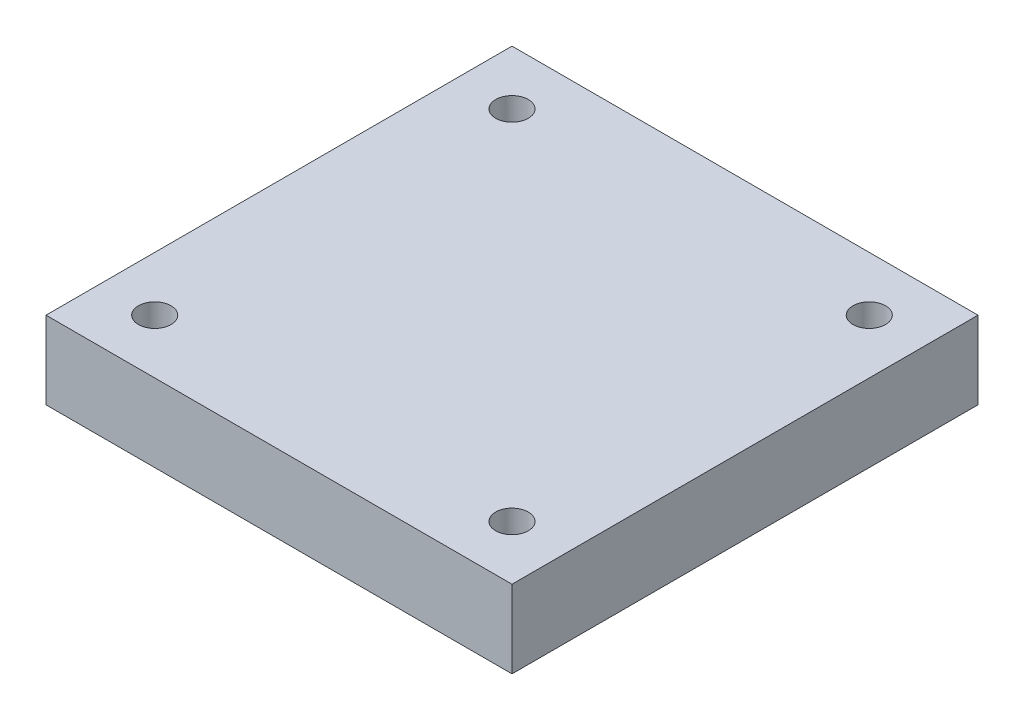
ISO-10303-21;
HEADER;
FILE_DESCRIPTION(('STEP AP214'),'2;1');
FILE_NAME('part.step','',(''),(''),'','','');
FILE_SCHEMA(('AUTOMOTIVE_DESIGN { 1 0 10303 214 1 1 1 1 }'));
ENDSEC;
DATA;
#1=APPLICATION_CONTEXT('core data for automotive mechanical design processes');
#2=APPLICATION_PROTOCOL_DEFINITION('international standard','automotive_design',2000,#1);
#3=PRODUCT_CONTEXT('',#1,'mechanical');
#4=PRODUCT('Part','Part','',(#3));
#5=PRODUCT_RELATED_PRODUCT_CATEGORY('part','',(#4));
#6=PRODUCT_DEFINITION_FORMATION('','',#4);
#7=PRODUCT_DEFINITION_CONTEXT('part definition',#1,'design');
#8=PRODUCT_DEFINITION('design','',#6,#7);
#9=PRODUCT_DEFINITION_SHAPE('','',#8);
#10=(LENGTH_UNIT() NAMED_UNIT(*) SI_UNIT(.MILLI.,.METRE.));
#11=(NAMED_UNIT(*) PLANE_ANGLE_UNIT() SI_UNIT($,.RADIAN.));
#12=(NAMED_UNIT(*) SI_UNIT($,.STERADIAN.) SOLID_ANGLE_UNIT());
#13=UNCERTAINTY_MEASURE_WITH_UNIT(LENGTH_MEASURE(1.E-05),#10,'distance_accuracy_value','');
#14=(GEOMETRIC_REPRESENTATION_CONTEXT(3) GLOBAL_UNCERTAINTY_ASSIGNED_CONTEXT((#13)) GLOBAL_UNIT_ASSIGNED_CONTEXT((#10,
#11,#12)) REPRESENTATION_CONTEXT('',''));
#15=CARTESIAN_POINT('',(0.,0.,0.));
#16=DIRECTION('',(0.,0.,1.));
#17=DIRECTION('',(1.,0.,0.));
#18=AXIS2_PLACEMENT_3D('',#15,#16,#17);
#19=CARTESIAN_POINT('',(30.,10.,30.));
#20=DIRECTION('',(-1.,0.,0.));
#21=DIRECTION('',(0.,0.,1.));
#22=AXIS2_PLACEMENT_3D('',#19,#20,#21);
#23=PLANE('',#22);
#24=DIRECTION('',(0.,0.,-1.));
#25=VECTOR('',#24,1.);
#26=CARTESIAN_POINT('',(30.,0.,30.));
#27=LINE('',#26,#25);
#28=CARTESIAN_POINT('',(30.,0.,30.));
#29=VERTEX_POINT('',#28);
#30=CARTESIAN_POINT('',(30.,0.,-30.));
#31=VERTEX_POINT('',#30);
#32=EDGE_CURVE('E98',#29,#31,#27,.T.);
#33=ORIENTED_EDGE('',*,*,#32,.T.);
#34=DIRECTION('',(0.,-1.,0.));
#35=VECTOR('',#34,1.);
#36=CARTESIAN_POINT('',(30.,10.,-30.));
#37=LINE('',#36,#35);
#38=CARTESIAN_POINT('',(30.,10.,-30.));
#39=VERTEX_POINT('',#38);
#40=EDGE_CURVE('E11',#39,#31,#37,.T.);
#41=ORIENTED_EDGE('',*,*,#40,.F.);
#42=DIRECTION('',(0.,0.,-1.));
#43=VECTOR('',#42,1.);
#44=CARTESIAN_POINT('',(30.,10.,30.));
#45=LINE('',#44,#43);
#46=CARTESIAN_POINT('',(30.,10.,30.));
#47=VERTEX_POINT('',#46);
#48=EDGE_CURVE('E86',#47,#39,#45,.T.);
#49=ORIENTED_EDGE('',*,*,#48,.F.);
#50=DIRECTION('',(0.,-1.,0.));
#51=VECTOR('',#50,1.);
#52=CARTESIAN_POINT('',(30.,10.,30.));
#53=LINE('',#52,#51);
#54=EDGE_CURVE('E94',#47,#29,#53,.T.);
#55=ORIENTED_EDGE('',*,*,#54,.T.);
#56=EDGE_LOOP('',(#33,#41,#49,#55));
#57=FACE_BOUND('',#56,.T.);
#58=ADVANCED_FACE('F35',(#57),#23,.F.);
#59=CARTESIAN_POINT('',(-30.,10.,-30.));
#60=DIRECTION('',(0.,0.,1.));
#61=DIRECTION('',(1.,0.,0.));
#62=AXIS2_PLACEMENT_3D('',#59,#60,#61);
#63=PLANE('',#62);
#64=DIRECTION('',(-1.,0.,0.));
#65=VECTOR('',#64,1.);
#66=CARTESIAN_POINT('',(-30.,0.,-30.));
#67=LINE('',#66,#65);
#68=CARTESIAN_POINT('',(-30.,0.,-30.));
#69=VERTEX_POINT('',#68);
#70=EDGE_CURVE('E90',#31,#69,#67,.T.);
#71=ORIENTED_EDGE('',*,*,#70,.T.);
#72=DIRECTION('',(0.,-1.,0.));
#73=VECTOR('',#72,1.);
#74=CARTESIAN_POINT('',(-30.,10.,-30.));
#75=LINE('',#74,#73);
#76=CARTESIAN_POINT('',(-30.,10.,-30.));
#77=VERTEX_POINT('',#76);
#78=EDGE_CURVE('E43',#77,#69,#75,.T.);
#79=ORIENTED_EDGE('',*,*,#78,.F.);
#80=DIRECTION('',(-1.,0.,0.));
#81=VECTOR('',#80,1.);
#82=CARTESIAN_POINT('',(-30.,10.,-30.));
#83=LINE('',#82,#81);
#84=EDGE_CURVE('E81',#39,#77,#83,.T.);
#85=ORIENTED_EDGE('',*,*,#84,.F.);
#86=ORIENTED_EDGE('',*,*,#40,.T.);
#87=EDGE_LOOP('',(#71,#79,#85,#86));
#88=FACE_BOUND('',#87,.T.);
#89=ADVANCED_FACE('F89',(#88),#63,.F.);
#90=CARTESIAN_POINT('',(-30.,10.,30.));
#91=DIRECTION('',(1.,0.,0.));
#92=DIRECTION('',(0.,0.,-1.));
#93=AXIS2_PLACEMENT_3D('',#90,#91,#92);
#94=PLANE('',#93);
#95=DIRECTION('',(0.,0.,1.));
#96=VECTOR('',#95,1.);
#97=CARTESIAN_POINT('',(-30.,0.,30.));
#98=LINE('',#97,#96);
#99=CARTESIAN_POINT('',(-30.,0.,30.));
#100=VERTEX_POINT('',#99);
#101=EDGE_CURVE('E68',#69,#100,#98,.T.);
#102=ORIENTED_EDGE('',*,*,#101,.T.);
#103=DIRECTION('',(0.,-1.,0.));
#104=VECTOR('',#103,1.);
#105=CARTESIAN_POINT('',(-30.,10.,30.));
#106=LINE('',#105,#104);
#107=CARTESIAN_POINT('',(-30.,10.,30.));
#108=VERTEX_POINT('',#107);
#109=EDGE_CURVE('E91',#108,#100,#106,.T.);
#110=ORIENTED_EDGE('',*,*,#109,.F.);
#111=DIRECTION('',(0.,0.,1.));
#112=VECTOR('',#111,1.);
#113=CARTESIAN_POINT('',(-30.,10.,30.));
#114=LINE('',#113,#112);
#115=EDGE_CURVE('E84',#77,#108,#114,.T.);
#116=ORIENTED_EDGE('',*,*,#115,.F.);
#117=ORIENTED_EDGE('',*,*,#78,.T.);
#118=EDGE_LOOP('',(#102,#110,#116,#117));
#119=FACE_BOUND('',#118,.T.);
#120=ADVANCED_FACE('F92',(#119),#94,.F.);
#121=CARTESIAN_POINT('',(-30.,10.,30.));
#122=DIRECTION('',(0.,0.,-1.));
#123=DIRECTION('',(-1.,0.,0.));
#124=AXIS2_PLACEMENT_3D('',#121,#122,#123);
#125=PLANE('',#124);
#126=DIRECTION('',(1.,0.,0.));
#127=VECTOR('',#126,1.);
#128=CARTESIAN_POINT('',(-30.,0.,30.));
#129=LINE('',#128,#127);
#130=EDGE_CURVE('E74',#100,#29,#129,.T.);
#131=ORIENTED_EDGE('',*,*,#130,.T.);
#132=ORIENTED_EDGE('',*,*,#54,.F.);
#133=DIRECTION('',(1.,0.,0.));
#134=VECTOR('',#133,1.);
#135=CARTESIAN_POINT('',(-30.,10.,30.));
#136=LINE('',#135,#134);
#137=EDGE_CURVE('E51',#108,#47,#136,.T.);
#138=ORIENTED_EDGE('',*,*,#137,.F.);
#139=ORIENTED_EDGE('',*,*,#109,.T.);
#140=EDGE_LOOP('',(#131,#132,#138,#139));
#141=FACE_BOUND('',#140,.T.);
#142=ADVANCED_FACE('F106',(#141),#125,.F.);
#143=CARTESIAN_POINT('',(0.,10.,0.));
#144=DIRECTION('',(0.,-1.,0.));
#145=DIRECTION('',(0.,0.,-1.));
#146=AXIS2_PLACEMENT_3D('',#143,#144,#145);
#147=PLANE('',#146);
#148=CARTESIAN_POINT('',(-23.,10.,-23.));
#149=DIRECTION('',(0.,1.,0.));
#150=DIRECTION('',(0.,0.,1.));
#151=AXIS2_PLACEMENT_3D('',#148,#149,#150);
#152=CIRCLE('',#151,2.1);
#153=CARTESIAN_POINT('',(-23.,10.,-20.9));
#154=VERTEX_POINT('',#153);
#155=EDGE_CURVE('E132',#154,#154,#152,.T.);
#156=ORIENTED_EDGE('',*,*,#155,.F.);
#157=EDGE_LOOP('',(#156));
#158=FACE_BOUND('',#157,.T.);
#159=CARTESIAN_POINT('',(23.,10.,-23.));
#160=DIRECTION('',(0.,1.,0.));
#161=DIRECTION('',(0.,0.,1.));
#162=AXIS2_PLACEMENT_3D('',#159,#160,#161);
#163=CIRCLE('',#162,2.1);
#164=CARTESIAN_POINT('',(23.,10.,-20.9));
#165=VERTEX_POINT('',#164);
#166=EDGE_CURVE('E126',#165,#165,#163,.T.);
#167=ORIENTED_EDGE('',*,*,#166,.F.);
#168=EDGE_LOOP('',(#167));
#169=FACE_BOUND('',#168,.T.);
#170=CARTESIAN_POINT('',(23.,10.,23.));
#171=DIRECTION('',(0.,1.,0.));
#172=DIRECTION('',(0.,0.,1.));
#173=AXIS2_PLACEMENT_3D('',#170,#171,#172);
#174=CIRCLE('',#173,2.1);
#175=CARTESIAN_POINT('',(23.,10.,25.1));
#176=VERTEX_POINT('',#175);
#177=EDGE_CURVE('E120',#176,#176,#174,.T.);
#178=ORIENTED_EDGE('',*,*,#177,.F.);
#179=EDGE_LOOP('',(#178));
#180=FACE_BOUND('',#179,.T.);
#181=CARTESIAN_POINT('',(-23.,10.,23.));
#182=DIRECTION('',(0.,1.,0.));
#183=DIRECTION('',(0.,0.,1.));
#184=AXIS2_PLACEMENT_3D('',#181,#182,#183);
#185=CIRCLE('',#184,2.1);
#186=CARTESIAN_POINT('',(-23.,10.,25.1));
#187=VERTEX_POINT('',#186);
#188=EDGE_CURVE('E114',#187,#187,#185,.T.);
#189=ORIENTED_EDGE('',*,*,#188,.F.);
#190=EDGE_LOOP('',(#189));
#191=FACE_BOUND('',#190,.T.);
#192=ORIENTED_EDGE('',*,*,#48,.T.);
#193=ORIENTED_EDGE('',*,*,#84,.T.);
#194=ORIENTED_EDGE('',*,*,#115,.T.);
#195=ORIENTED_EDGE('',*,*,#137,.T.);
#196=EDGE_LOOP('',(#192,#193,#194,#195));
#197=FACE_BOUND('',#196,.T.);
#198=ADVANCED_FACE('F82',(#158,#169,#180,#191,#197),#147,.F.);
#199=CARTESIAN_POINT('',(0.,0.,0.));
#200=DIRECTION('',(0.,-1.,0.));
#201=DIRECTION('',(0.,0.,-1.));
#202=AXIS2_PLACEMENT_3D('',#199,#200,#201);
#203=PLANE('',#202);
#204=CARTESIAN_POINT('',(-23.,0.,-23.));
#205=DIRECTION('',(0.,1.,0.));
#206=DIRECTION('',(0.,0.,1.));
#207=AXIS2_PLACEMENT_3D('',#204,#205,#206);
#208=CIRCLE('',#207,2.1);
#209=CARTESIAN_POINT('',(-23.,0.,-20.9));
#210=VERTEX_POINT('',#209);
#211=EDGE_CURVE('E129',#210,#210,#208,.T.);
#212=ORIENTED_EDGE('',*,*,#211,.T.);
#213=EDGE_LOOP('',(#212));
#214=FACE_BOUND('',#213,.T.);
#215=CARTESIAN_POINT('',(23.,0.,-23.));
#216=DIRECTION('',(0.,1.,0.));
#217=DIRECTION('',(0.,0.,1.));
#218=AXIS2_PLACEMENT_3D('',#215,#216,#217);
#219=CIRCLE('',#218,2.1);
#220=CARTESIAN_POINT('',(23.,0.,-20.9));
#221=VERTEX_POINT('',#220);
#222=EDGE_CURVE('E123',#221,#221,#219,.T.);
#223=ORIENTED_EDGE('',*,*,#222,.T.);
#224=EDGE_LOOP('',(#223));
#225=FACE_BOUND('',#224,.T.);
#226=CARTESIAN_POINT('',(23.,0.,23.));
#227=DIRECTION('',(0.,1.,0.));
#228=DIRECTION('',(0.,0.,1.));
#229=AXIS2_PLACEMENT_3D('',#226,#227,#228);
#230=CIRCLE('',#229,2.1);
#231=CARTESIAN_POINT('',(23.,0.,25.1));
#232=VERTEX_POINT('',#231);
#233=EDGE_CURVE('E117',#232,#232,#230,.T.);
#234=ORIENTED_EDGE('',*,*,#233,.T.);
#235=EDGE_LOOP('',(#234));
#236=FACE_BOUND('',#235,.T.);
#237=CARTESIAN_POINT('',(-23.,0.,23.));
#238=DIRECTION('',(0.,1.,0.));
#239=DIRECTION('',(0.,0.,1.));
#240=AXIS2_PLACEMENT_3D('',#237,#238,#239);
#241=CIRCLE('',#240,2.1);
#242=CARTESIAN_POINT('',(-23.,0.,25.1));
#243=VERTEX_POINT('',#242);
#244=EDGE_CURVE('E101',#243,#243,#241,.T.);
#245=ORIENTED_EDGE('',*,*,#244,.T.);
#246=EDGE_LOOP('',(#245));
#247=FACE_BOUND('',#246,.T.);
#248=ORIENTED_EDGE('',*,*,#32,.F.);
#249=ORIENTED_EDGE('',*,*,#130,.F.);
#250=ORIENTED_EDGE('',*,*,#101,.F.);
#251=ORIENTED_EDGE('',*,*,#70,.F.);
#252=EDGE_LOOP('',(#248,#249,#250,#251));
#253=FACE_BOUND('',#252,.T.);
#254=ADVANCED_FACE('F109',(#214,#225,#236,#247,#253),#203,.T.);
#255=CARTESIAN_POINT('',(-23.,10.,23.));
#256=DIRECTION('',(0.,1.,0.));
#257=DIRECTION('',(0.,0.,1.));
#258=AXIS2_PLACEMENT_3D('',#255,#256,#257);
#259=CYLINDRICAL_SURFACE('',#258,2.1);
#260=ORIENTED_EDGE('',*,*,#244,.F.);
#261=EDGE_LOOP('',(#260));
#262=FACE_BOUND('',#261,.T.);
#263=ORIENTED_EDGE('',*,*,#188,.T.);
#264=EDGE_LOOP('',(#263));
#265=FACE_BOUND('',#264,.T.);
#266=ADVANCED_FACE('F147',(#262,#265),#259,.F.);
#267=CARTESIAN_POINT('',(23.,10.,23.));
#268=DIRECTION('',(0.,1.,0.));
#269=DIRECTION('',(0.,0.,1.));
#270=AXIS2_PLACEMENT_3D('',#267,#268,#269);
#271=CYLINDRICAL_SURFACE('',#270,2.1);
#272=ORIENTED_EDGE('',*,*,#233,.F.);
#273=EDGE_LOOP('',(#272));
#274=FACE_BOUND('',#273,.T.);
#275=ORIENTED_EDGE('',*,*,#177,.T.);
#276=EDGE_LOOP('',(#275));
#277=FACE_BOUND('',#276,.T.);
#278=ADVANCED_FACE('F149',(#274,#277),#271,.F.);
#279=CARTESIAN_POINT('',(23.,10.,-23.));
#280=DIRECTION('',(0.,1.,0.));
#281=DIRECTION('',(0.,0.,1.));
#282=AXIS2_PLACEMENT_3D('',#279,#280,#281);
#283=CYLINDRICAL_SURFACE('',#282,2.1);
#284=ORIENTED_EDGE('',*,*,#222,.F.);
#285=EDGE_LOOP('',(#284));
#286=FACE_BOUND('',#285,.T.);
#287=ORIENTED_EDGE('',*,*,#166,.T.);
#288=EDGE_LOOP('',(#287));
#289=FACE_BOUND('',#288,.T.);
#290=ADVANCED_FACE('F156',(#286,#289),#283,.F.);
#291=CARTESIAN_POINT('',(-23.,10.,-23.));
#292=DIRECTION('',(0.,1.,0.));
#293=DIRECTION('',(0.,0.,1.));
#294=AXIS2_PLACEMENT_3D('',#291,#292,#293);
#295=CYLINDRICAL_SURFACE('',#294,2.1);
#296=ORIENTED_EDGE('',*,*,#211,.F.);
#297=EDGE_LOOP('',(#296));
#298=FACE_BOUND('',#297,.T.);
#299=ORIENTED_EDGE('',*,*,#155,.T.);
#300=EDGE_LOOP('',(#299));
#301=FACE_BOUND('',#300,.T.);
#302=ADVANCED_FACE('F136',(#298,#301),#295,.F.);
#303=CLOSED_SHELL('',(#58,#89,#120,#142,#198,#254,#266,#278,#290,#302));
#304=MANIFOLD_SOLID_BREP('B2',#303);
#305=ADVANCED_BREP_SHAPE_REPRESENTATION('',(#18,#304),#14);
#306=SHAPE_DEFINITION_REPRESENTATION(#9,#305);
ENDSEC;
END-ISO-10303-21;
